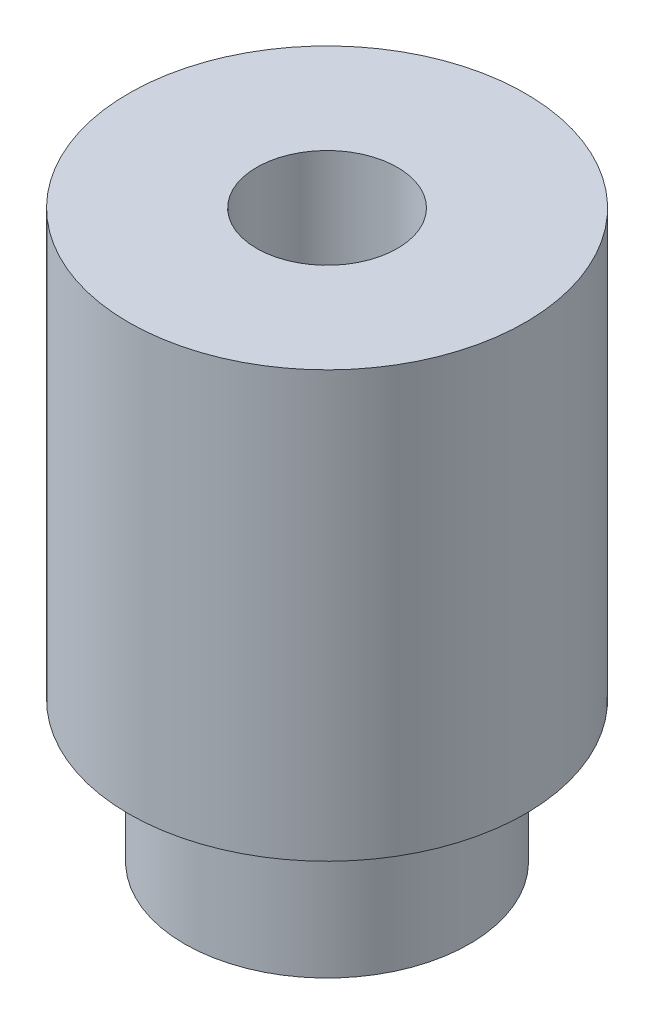
ISO-10303-21;
HEADER;
FILE_DESCRIPTION(('STEP AP214'),'2;1');
FILE_NAME('part.step','',(''),(''),'','','');
FILE_SCHEMA(('AUTOMOTIVE_DESIGN { 1 0 10303 214 1 1 1 1 }'));
ENDSEC;
DATA;
#1=APPLICATION_CONTEXT('core data for automotive mechanical design processes');
#2=APPLICATION_PROTOCOL_DEFINITION('international standard','automotive_design',2000,#1);
#3=PRODUCT_CONTEXT('',#1,'mechanical');
#4=PRODUCT('Part','Part','',(#3));
#5=PRODUCT_RELATED_PRODUCT_CATEGORY('part','',(#4));
#6=PRODUCT_DEFINITION_FORMATION('','',#4);
#7=PRODUCT_DEFINITION_CONTEXT('part definition',#1,'design');
#8=PRODUCT_DEFINITION('design','',#6,#7);
#9=PRODUCT_DEFINITION_SHAPE('','',#8);
#10=(LENGTH_UNIT() NAMED_UNIT(*) SI_UNIT(.MILLI.,.METRE.));
#11=(NAMED_UNIT(*) PLANE_ANGLE_UNIT() SI_UNIT($,.RADIAN.));
#12=(NAMED_UNIT(*) SI_UNIT($,.STERADIAN.) SOLID_ANGLE_UNIT());
#13=UNCERTAINTY_MEASURE_WITH_UNIT(LENGTH_MEASURE(1.E-05),#10,'distance_accuracy_value','');
#14=(GEOMETRIC_REPRESENTATION_CONTEXT(3) GLOBAL_UNCERTAINTY_ASSIGNED_CONTEXT((#13)) GLOBAL_UNIT_ASSIGNED_CONTEXT((#10,
#11,#12)) REPRESENTATION_CONTEXT('',''));
#15=CARTESIAN_POINT('',(0.,0.,0.));
#16=DIRECTION('',(0.,0.,1.));
#17=DIRECTION('',(1.,0.,0.));
#18=AXIS2_PLACEMENT_3D('',#15,#16,#17);
#19=CARTESIAN_POINT('',(0.,9.906,0.));
#20=DIRECTION('',(0.,-1.,0.));
#21=DIRECTION('',(0.,0.,-1.));
#22=AXIS2_PLACEMENT_3D('',#19,#20,#21);
#23=CYLINDRICAL_SURFACE('',#22,10.033);
#24=CARTESIAN_POINT('',(0.,9.906,0.));
#25=DIRECTION('',(0.,1.,0.));
#26=DIRECTION('',(0.,0.,1.));
#27=AXIS2_PLACEMENT_3D('',#24,#25,#26);
#28=CIRCLE('',#27,10.033);
#29=CARTESIAN_POINT('',(0.,9.906,10.033));
#30=VERTEX_POINT('',#29);
#31=EDGE_CURVE('E10',#30,#30,#28,.T.);
#32=ORIENTED_EDGE('',*,*,#31,.F.);
#33=EDGE_LOOP('',(#32));
#34=FACE_BOUND('',#33,.T.);
#35=CARTESIAN_POINT('',(0.,0.,0.));
#36=DIRECTION('',(0.,1.,0.));
#37=DIRECTION('',(0.,0.,1.));
#38=AXIS2_PLACEMENT_3D('',#35,#36,#37);
#39=CIRCLE('',#38,10.033);
#40=CARTESIAN_POINT('',(0.,0.,10.033));
#41=VERTEX_POINT('',#40);
#42=EDGE_CURVE('E46',#41,#41,#39,.T.);
#43=ORIENTED_EDGE('',*,*,#42,.T.);
#44=EDGE_LOOP('',(#43));
#45=FACE_BOUND('',#44,.T.);
#46=ADVANCED_FACE('F43',(#34,#45),#23,.T.);
#47=CARTESIAN_POINT('',(0.,0.,0.));
#48=DIRECTION('',(0.,1.,0.));
#49=DIRECTION('',(0.,0.,1.));
#50=AXIS2_PLACEMENT_3D('',#47,#48,#49);
#51=PLANE('',#50);
#52=CARTESIAN_POINT('',(0.,0.,0.));
#53=DIRECTION('',(0.,1.,0.));
#54=DIRECTION('',(0.,0.,1.));
#55=AXIS2_PLACEMENT_3D('',#52,#53,#54);
#56=CIRCLE('',#55,4.953);
#57=CARTESIAN_POINT('',(0.,0.,4.953));
#58=VERTEX_POINT('',#57);
#59=EDGE_CURVE('E62',#58,#58,#56,.T.);
#60=ORIENTED_EDGE('',*,*,#59,.T.);
#61=EDGE_LOOP('',(#60));
#62=FACE_BOUND('',#61,.T.);
#63=ORIENTED_EDGE('',*,*,#42,.F.);
#64=EDGE_LOOP('',(#63));
#65=FACE_BOUND('',#64,.T.);
#66=ADVANCED_FACE('F73',(#62,#65),#51,.F.);
#67=CARTESIAN_POINT('',(0.,39.878,0.));
#68=DIRECTION('',(0.,-1.,0.));
#69=DIRECTION('',(0.,0.,-1.));
#70=AXIS2_PLACEMENT_3D('',#67,#68,#69);
#71=CYLINDRICAL_SURFACE('',#70,13.97);
#72=CARTESIAN_POINT('',(0.,39.878,0.));
#73=DIRECTION('',(0.,1.,0.));
#74=DIRECTION('',(0.,0.,1.));
#75=AXIS2_PLACEMENT_3D('',#72,#73,#74);
#76=CIRCLE('',#75,13.97);
#77=CARTESIAN_POINT('',(0.,39.878,13.97));
#78=VERTEX_POINT('',#77);
#79=EDGE_CURVE('E57',#78,#78,#76,.T.);
#80=ORIENTED_EDGE('',*,*,#79,.F.);
#81=EDGE_LOOP('',(#80));
#82=FACE_BOUND('',#81,.T.);
#83=CARTESIAN_POINT('',(0.,9.906,0.));
#84=DIRECTION('',(0.,1.,0.));
#85=DIRECTION('',(0.,0.,1.));
#86=AXIS2_PLACEMENT_3D('',#83,#84,#85);
#87=CIRCLE('',#86,13.97);
#88=CARTESIAN_POINT('',(0.,9.906,13.97));
#89=VERTEX_POINT('',#88);
#90=EDGE_CURVE('E59',#89,#89,#87,.T.);
#91=ORIENTED_EDGE('',*,*,#90,.T.);
#92=EDGE_LOOP('',(#91));
#93=FACE_BOUND('',#92,.T.);
#94=ADVANCED_FACE('F86',(#82,#93),#71,.T.);
#95=CARTESIAN_POINT('',(0.,39.878,0.));
#96=DIRECTION('',(0.,1.,0.));
#97=DIRECTION('',(0.,0.,1.));
#98=AXIS2_PLACEMENT_3D('',#95,#96,#97);
#99=PLANE('',#98);
#100=CARTESIAN_POINT('',(0.,39.878,0.));
#101=DIRECTION('',(0.,1.,0.));
#102=DIRECTION('',(0.,0.,1.));
#103=AXIS2_PLACEMENT_3D('',#100,#101,#102);
#104=CIRCLE('',#103,4.953);
#105=CARTESIAN_POINT('',(0.,39.878,4.953));
#106=VERTEX_POINT('',#105);
#107=EDGE_CURVE('E65',#106,#106,#104,.T.);
#108=ORIENTED_EDGE('',*,*,#107,.F.);
#109=EDGE_LOOP('',(#108));
#110=FACE_BOUND('',#109,.T.);
#111=ORIENTED_EDGE('',*,*,#79,.T.);
#112=EDGE_LOOP('',(#111));
#113=FACE_BOUND('',#112,.T.);
#114=ADVANCED_FACE('F83',(#110,#113),#99,.T.);
#115=CARTESIAN_POINT('',(0.,9.906,0.));
#116=DIRECTION('',(0.,1.,0.));
#117=DIRECTION('',(0.,0.,1.));
#118=AXIS2_PLACEMENT_3D('',#115,#116,#117);
#119=PLANE('',#118);
#120=ORIENTED_EDGE('',*,*,#31,.T.);
#121=EDGE_LOOP('',(#120));
#122=FACE_BOUND('',#121,.T.);
#123=ORIENTED_EDGE('',*,*,#90,.F.);
#124=EDGE_LOOP('',(#123));
#125=FACE_BOUND('',#124,.T.);
#126=ADVANCED_FACE('F79',(#122,#125),#119,.F.);
#127=CARTESIAN_POINT('',(0.,0.,0.));
#128=DIRECTION('',(0.,1.,0.));
#129=DIRECTION('',(0.,0.,1.));
#130=AXIS2_PLACEMENT_3D('',#127,#128,#129);
#131=CYLINDRICAL_SURFACE('',#130,4.953);
#132=ORIENTED_EDGE('',*,*,#59,.F.);
#133=EDGE_LOOP('',(#132));
#134=FACE_BOUND('',#133,.T.);
#135=ORIENTED_EDGE('',*,*,#107,.T.);
#136=EDGE_LOOP('',(#135));
#137=FACE_BOUND('',#136,.T.);
#138=ADVANCED_FACE('F76',(#134,#137),#131,.F.);
#139=CLOSED_SHELL('',(#46,#66,#94,#114,#126,#138));
#140=MANIFOLD_SOLID_BREP('B2',#139);
#141=ADVANCED_BREP_SHAPE_REPRESENTATION('',(#18,#140),#14);
#142=SHAPE_DEFINITION_REPRESENTATION(#9,#141);
ENDSEC;
END-ISO-10303-21;
